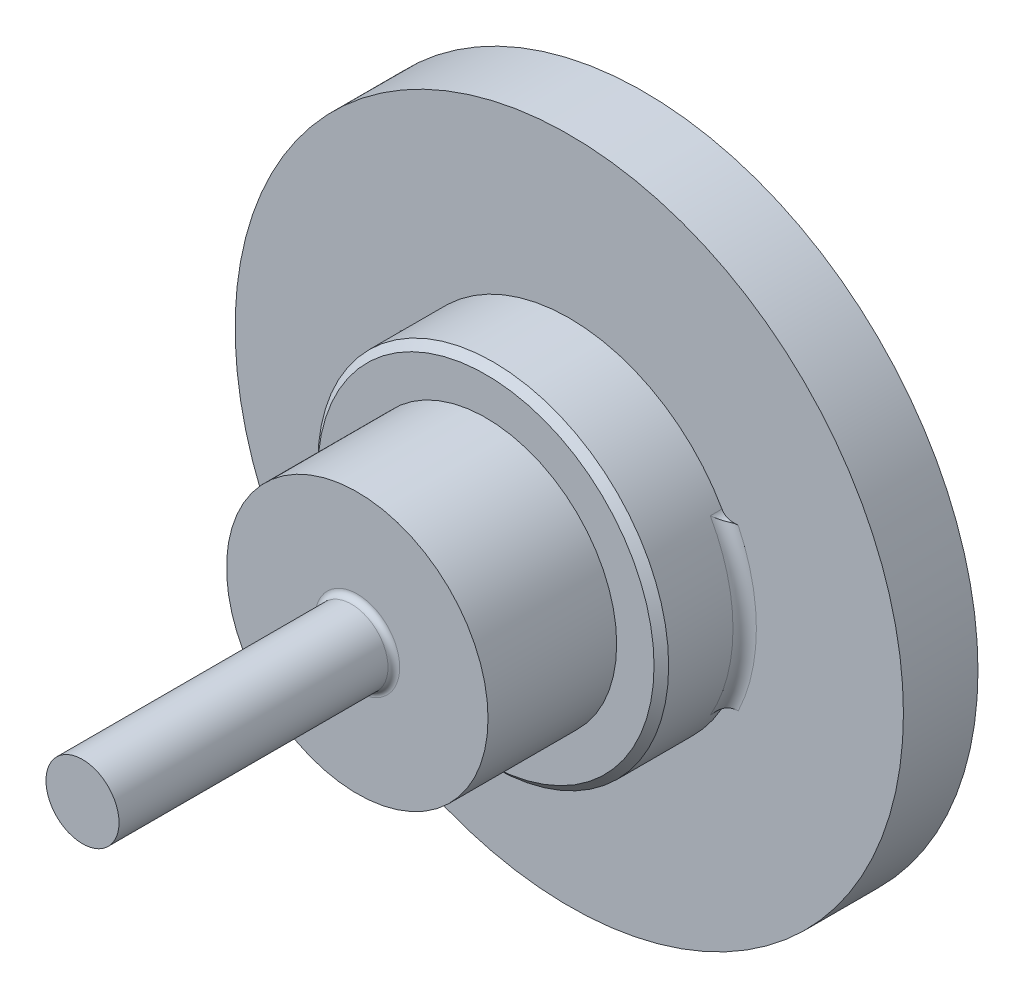
ISO-10303-21;
HEADER;
FILE_DESCRIPTION(('STEP AP214'),'2;1');
FILE_NAME('part.step','',(''),(''),'','','');
FILE_SCHEMA(('AUTOMOTIVE_DESIGN { 1 0 10303 214 1 1 1 1 }'));
ENDSEC;
DATA;
#1=APPLICATION_CONTEXT('core data for automotive mechanical design processes');
#2=APPLICATION_PROTOCOL_DEFINITION('international standard','automotive_design',2000,#1);
#3=PRODUCT_CONTEXT('',#1,'mechanical');
#4=PRODUCT('Part','Part','',(#3));
#5=PRODUCT_RELATED_PRODUCT_CATEGORY('part','',(#4));
#6=PRODUCT_DEFINITION_FORMATION('','',#4);
#7=PRODUCT_DEFINITION_CONTEXT('part definition',#1,'design');
#8=PRODUCT_DEFINITION('design','',#6,#7);
#9=PRODUCT_DEFINITION_SHAPE('','',#8);
#10=(LENGTH_UNIT() NAMED_UNIT(*) SI_UNIT(.MILLI.,.METRE.));
#11=(NAMED_UNIT(*) PLANE_ANGLE_UNIT() SI_UNIT($,.RADIAN.));
#12=(NAMED_UNIT(*) SI_UNIT($,.STERADIAN.) SOLID_ANGLE_UNIT());
#13=UNCERTAINTY_MEASURE_WITH_UNIT(LENGTH_MEASURE(1.E-05),#10,'distance_accuracy_value','');
#14=(GEOMETRIC_REPRESENTATION_CONTEXT(3) GLOBAL_UNCERTAINTY_ASSIGNED_CONTEXT((#13)) GLOBAL_UNIT_ASSIGNED_CONTEXT((#10,
#11,#12)) REPRESENTATION_CONTEXT('',''));
#15=CARTESIAN_POINT('',(0.,0.,0.));
#16=DIRECTION('',(0.,0.,1.));
#17=DIRECTION('',(1.,0.,0.));
#18=AXIS2_PLACEMENT_3D('',#15,#16,#17);
#19=CARTESIAN_POINT('',(0.,0.,93.9999996618));
#20=DIRECTION('',(0.,0.,1.));
#21=DIRECTION('',(1.,0.,0.));
#22=AXIS2_PLACEMENT_3D('',#19,#20,#21);
#23=PLANE('',#22);
#24=CARTESIAN_POINT('',(0.,0.,93.9999996618));
#25=DIRECTION('',(0.,0.,1.));
#26=DIRECTION('',(1.,0.,0.));
#27=AXIS2_PLACEMENT_3D('',#24,#25,#26);
#28=CIRCLE('',#27,6.24999997775);
#29=CARTESIAN_POINT('',(6.24999997775,0.,93.9999996618));
#30=VERTEX_POINT('',#29);
#31=EDGE_CURVE('E14',#30,#30,#28,.T.);
#32=ORIENTED_EDGE('',*,*,#31,.T.);
#33=EDGE_LOOP('',(#32));
#34=FACE_BOUND('',#33,.T.);
#35=ADVANCED_FACE('F51',(#34),#23,.T.);
#36=CARTESIAN_POINT('',(0.,0.,24.999999911));
#37=DIRECTION('',(0.,0.,1.));
#38=DIRECTION('',(1.,0.,0.));
#39=AXIS2_PLACEMENT_3D('',#36,#37,#38);
#40=PLANE('',#39);
#41=CARTESIAN_POINT('',(0.,0.,24.999999911));
#42=DIRECTION('',(0.,0.,1.));
#43=DIRECTION('',(1.,0.,0.));
#44=AXIS2_PLACEMENT_3D('',#41,#42,#43);
#45=CIRCLE('',#44,22.3588115081785);
#46=CARTESIAN_POINT('',(22.3588115081785,0.,24.999999911));
#47=VERTEX_POINT('',#46);
#48=EDGE_CURVE('E176',#47,#47,#45,.T.);
#49=ORIENTED_EDGE('',*,*,#48,.F.);
#50=EDGE_LOOP('',(#49));
#51=FACE_BOUND('',#50,.T.);
#52=CARTESIAN_POINT('',(0.,0.,24.9999999110001));
#53=DIRECTION('',(0.,0.,-1.));
#54=DIRECTION('',(-1.,0.,0.));
#55=AXIS2_PLACEMENT_3D('',#52,#53,#54);
#56=CIRCLE('',#55,28.7499998976501);
#57=CARTESIAN_POINT('',(-28.7499998976501,0.,24.9999999110001));
#58=VERTEX_POINT('',#57);
#59=EDGE_CURVE('E275',#58,#58,#56,.T.);
#60=ORIENTED_EDGE('',*,*,#59,.F.);
#61=EDGE_LOOP('',(#60));
#62=FACE_BOUND('',#61,.T.);
#63=ADVANCED_FACE('F567',(#51,#62),#40,.T.);
#64=CARTESIAN_POINT('',(0.,0.,23.7499999154499));
#65=DIRECTION('',(0.,0.,-1.));
#66=DIRECTION('',(-1.,0.,0.));
#67=AXIS2_PLACEMENT_3D('',#64,#65,#66);
#68=CONICAL_SURFACE('',#67,29.9999998931999,0.785398163397298);
#69=CARTESIAN_POINT('',(0.,0.,23.74999991545));
#70=DIRECTION('',(0.,0.,1.));
#71=DIRECTION('',(1.,0.,0.));
#72=AXIS2_PLACEMENT_3D('',#69,#70,#71);
#73=CIRCLE('',#72,29.9999998932);
#74=CARTESIAN_POINT('',(29.9999998932,0.,23.74999991545));
#75=VERTEX_POINT('',#74);
#76=EDGE_CURVE('E1326',#75,#75,#73,.F.);
#77=ORIENTED_EDGE('',*,*,#76,.F.);
#78=EDGE_LOOP('',(#77));
#79=FACE_BOUND('',#78,.T.);
#80=ORIENTED_EDGE('',*,*,#59,.T.);
#81=EDGE_LOOP('',(#80));
#82=FACE_BOUND('',#81,.T.);
#83=ADVANCED_FACE('F577',(#79,#82),#68,.T.);
#84=CARTESIAN_POINT('',(0.,0.,4.9999999822));
#85=DIRECTION('',(0.,0.,1.));
#86=DIRECTION('',(1.,0.,0.));
#87=AXIS2_PLACEMENT_3D('',#84,#85,#86);
#88=CYLINDRICAL_SURFACE('',#87,29.9999998932);
#89=CARTESIAN_POINT('',(0.,0.,10.74999996173));
#90=DIRECTION('',(0.,0.,1.));
#91=DIRECTION('',(1.,0.,0.));
#92=AXIS2_PLACEMENT_3D('',#89,#90,#91);
#93=CIRCLE('',#92,29.9999998932);
#94=CARTESIAN_POINT('',(26.1146762071369,-14.765624950824,10.74999996173));
#95=VERTEX_POINT('',#94);
#96=CARTESIAN_POINT('',(-26.1146762071369,-14.765624950824,10.74999996173));
#97=VERTEX_POINT('',#96);
#98=EDGE_CURVE('E197',#95,#97,#93,.F.);
#99=ORIENTED_EDGE('',*,*,#98,.F.);
#100=DIRECTION('',(0.,0.,1.));
#101=VECTOR('',#100,1.);
#102=CARTESIAN_POINT('',(26.1146762071369,-14.765624950824,4.9999999822));
#103=LINE('',#102,#101);
#104=CARTESIAN_POINT('',(26.1146762071369,-14.765624950824,12.74999996173));
#105=VERTEX_POINT('',#104);
#106=EDGE_CURVE('E242',#95,#105,#103,.T.);
#107=ORIENTED_EDGE('',*,*,#106,.T.);
#108=CARTESIAN_POINT('',(0.,0.,12.74999996173));
#109=DIRECTION('',(0.,0.,1.));
#110=DIRECTION('',(1.,0.,0.));
#111=AXIS2_PLACEMENT_3D('',#108,#109,#110);
#112=CIRCLE('',#111,29.9999998932);
#113=CARTESIAN_POINT('',(26.1146762071369,14.765624950824,12.74999996173));
#114=VERTEX_POINT('',#113);
#115=EDGE_CURVE('E387',#105,#114,#112,.T.);
#116=ORIENTED_EDGE('',*,*,#115,.T.);
#117=DIRECTION('',(0.,0.,1.));
#118=VECTOR('',#117,1.);
#119=CARTESIAN_POINT('',(26.1146762071369,14.765624950824,4.9999999822));
#120=LINE('',#119,#118);
#121=CARTESIAN_POINT('',(26.1146762071369,14.765624950824,10.74999996173));
#122=VERTEX_POINT('',#121);
#123=EDGE_CURVE('E750',#114,#122,#120,.F.);
#124=ORIENTED_EDGE('',*,*,#123,.T.);
#125=CARTESIAN_POINT('',(-26.1146762071369,14.765624950824,10.74999996173));
#126=VERTEX_POINT('',#125);
#127=EDGE_CURVE('E73',#126,#122,#93,.F.);
#128=ORIENTED_EDGE('',*,*,#127,.F.);
#129=DIRECTION('',(0.,0.,1.));
#130=VECTOR('',#129,1.);
#131=CARTESIAN_POINT('',(-26.1146762071369,14.765624950824,4.9999999822));
#132=LINE('',#131,#130);
#133=CARTESIAN_POINT('',(-26.1146762071369,14.765624950824,12.74999996173));
#134=VERTEX_POINT('',#133);
#135=EDGE_CURVE('E236',#126,#134,#132,.T.);
#136=ORIENTED_EDGE('',*,*,#135,.T.);
#137=CARTESIAN_POINT('',(0.,0.,12.74999996173));
#138=DIRECTION('',(0.,0.,1.));
#139=DIRECTION('',(1.,0.,0.));
#140=AXIS2_PLACEMENT_3D('',#137,#138,#139);
#141=CIRCLE('',#140,29.9999998932);
#142=CARTESIAN_POINT('',(-26.1146762071369,-14.765624950824,12.74999996173));
#143=VERTEX_POINT('',#142);
#144=EDGE_CURVE('E885',#134,#143,#141,.T.);
#145=ORIENTED_EDGE('',*,*,#144,.T.);
#146=DIRECTION('',(0.,0.,1.));
#147=VECTOR('',#146,1.);
#148=CARTESIAN_POINT('',(-26.1146762071369,-14.765624950824,4.9999999822));
#149=LINE('',#148,#147);
#150=EDGE_CURVE('E906',#143,#97,#149,.F.);
#151=ORIENTED_EDGE('',*,*,#150,.T.);
#152=EDGE_LOOP('',(#99,#107,#116,#124,#128,#136,#145,#151));
#153=FACE_BOUND('',#152,.T.);
#154=ORIENTED_EDGE('',*,*,#76,.T.);
#155=EDGE_LOOP('',(#154));
#156=FACE_BOUND('',#155,.T.);
#157=ADVANCED_FACE('F916',(#153,#156),#88,.T.);
#158=CARTESIAN_POINT('',(-27.855654627144,-15.74999995105,4.9999999822));
#159=DIRECTION('',(0.,0.,1.));
#160=DIRECTION('',(1.,0.,0.));
#161=AXIS2_PLACEMENT_3D('',#158,#159,#160);
#162=CYLINDRICAL_SURFACE('',#161,2.);
#163=DIRECTION('',(0.,0.,-1.));
#164=VECTOR('',#163,1.);
#165=CARTESIAN_POINT('',(-27.855654627144,-13.74999995105,4.9999999822));
#166=LINE('',#165,#164);
#167=CARTESIAN_POINT('',(-27.855654627144,-13.74999995105,10.74999996173));
#168=VERTEX_POINT('',#167);
#169=CARTESIAN_POINT('',(-27.8556546271439,-13.74999995105,10.982305254763));
#170=VERTEX_POINT('',#169);
#171=EDGE_CURVE('E526',#168,#170,#166,.F.);
#172=ORIENTED_EDGE('',*,*,#171,.F.);
#173=CARTESIAN_POINT('',(-27.855654627144,-15.74999995105,10.74999996173));
#174=DIRECTION('',(0.,0.,1.));
#175=DIRECTION('',(1.,0.,0.));
#176=AXIS2_PLACEMENT_3D('',#173,#174,#175);
#177=CIRCLE('',#176,2.);
#178=EDGE_CURVE('E65',#168,#97,#177,.F.);
#179=ORIENTED_EDGE('',*,*,#178,.T.);
#180=ORIENTED_EDGE('',*,*,#150,.F.);
#181=CARTESIAN_POINT('',(-27.855654627144,-13.74999995105,10.982305254763));
#182=CARTESIAN_POINT('',(-27.8313606597694,-13.7500003890343,10.9938345583865));
#183=CARTESIAN_POINT('',(-27.8072266103018,-13.7504476350383,11.0056958861992));
#184=CARTESIAN_POINT('',(-27.7588066246078,-13.7522138707827,11.0302933425393));
#185=CARTESIAN_POINT('',(-27.7345279699694,-13.7535507987732,11.043042535003));
#186=CARTESIAN_POINT('',(-27.6858546732368,-13.7571084319172,11.0694174048585));
#187=CARTESIAN_POINT('',(-27.6614682878886,-13.7593470936084,11.0830558605991));
#188=CARTESIAN_POINT('',(-27.6126144011471,-13.7647215409892,11.1112097021366));
#189=CARTESIAN_POINT('',(-27.5881560489802,-13.7678752624635,11.1257375203609));
#190=CARTESIAN_POINT('',(-27.539193893966,-13.7750936627142,11.15566855148));
#191=CARTESIAN_POINT('',(-27.5147000875535,-13.7791762108212,11.1710837848152));
#192=CARTESIAN_POINT('',(-27.4657028607032,-13.7882667566445,11.202786260134));
#193=CARTESIAN_POINT('',(-27.4412102256504,-13.7932925249166,11.219085056376));
#194=CARTESIAN_POINT('',(-27.3922514677708,-13.8042847838722,11.2525491333906));
#195=CARTESIAN_POINT('',(-27.367796865183,-13.8102689250243,11.2697254500589));
#196=CARTESIAN_POINT('',(-27.3189502049049,-13.8231932424153,11.3049374308567));
#197=CARTESIAN_POINT('',(-27.2945703426456,-13.8301509192724,11.3229835787095));
#198=CARTESIAN_POINT('',(-27.2500373381576,-13.843777583964,11.3567908059341));
#199=CARTESIAN_POINT('',(-27.2298000539143,-13.8503325602401,11.3724872716226));
#200=CARTESIAN_POINT('',(-27.1892453854812,-13.8641817929777,11.404603594771));
#201=CARTESIAN_POINT('',(-27.1689395693626,-13.871490827361,11.421031652432));
#202=CARTESIAN_POINT('',(-27.10718177185,-13.8948400457953,11.4720441411635));
#203=CARTESIAN_POINT('',(-27.0664956810631,-13.9118097500889,11.5071375154306));
#204=CARTESIAN_POINT('',(-26.9851662283147,-13.9488433471493,11.5802153607757));
#205=CARTESIAN_POINT('',(-26.944625570408,-13.9690191326553,11.6182568235603));
#206=CARTESIAN_POINT('',(-26.8638662472033,-14.0126127939556,11.6972183192776));
#207=CARTESIAN_POINT('',(-26.823755921592,-14.0361396429998,11.7381889713169));
#208=CARTESIAN_POINT('',(-26.7521965870043,-14.0815075877282,11.814370265486));
#209=CARTESIAN_POINT('',(-26.7203914359796,-14.1030121500848,11.8494486651928));
#210=CARTESIAN_POINT('',(-26.6562540943645,-14.1490730322139,11.922689105163));
#211=CARTESIAN_POINT('',(-26.6240466813853,-14.1737376167037,11.9608923610095));
#212=CARTESIAN_POINT('',(-26.5594712384655,-14.2263200478081,12.0404058642384));
#213=CARTESIAN_POINT('',(-26.5272363336648,-14.2543451516223,12.081753120417));
#214=CARTESIAN_POINT('',(-26.4629973072764,-14.3138550068254,12.1675539983191));
#215=CARTESIAN_POINT('',(-26.4311347046991,-14.3454464989986,12.2120396832831));
#216=CARTESIAN_POINT('',(-26.3796575923875,-14.4000614264173,12.2870244762664));
#217=CARTESIAN_POINT('',(-26.3593888779643,-14.4225881609983,12.3174395904513));
#218=CARTESIAN_POINT('',(-26.3155196205064,-14.4736016433946,12.3853372887643));
#219=CARTESIAN_POINT('',(-26.2922049213142,-14.502282174075,12.4228595196564));
#220=CARTESIAN_POINT('',(-26.2431592414998,-14.5661025763612,12.5050594729249));
#221=CARTESIAN_POINT('',(-26.2177772499626,-14.6014571337432,12.5497788681545));
#222=CARTESIAN_POINT('',(-26.1656749187223,-14.6792635005503,12.6463301745204));
#223=CARTESIAN_POINT('',(-26.1393630249264,-14.7219623723626,12.6981838331913));
#224=CARTESIAN_POINT('',(-26.1146762071369,-14.765624950824,12.74999996173));
#225=B_SPLINE_CURVE_WITH_KNOTS('',3,(#181,#182,#183,#184,#185,#186,#187,#188,#189,#190,#191,
#192,#193,#194,#195,#196,#197,#198,#199,#200,#201,#202,#203,#204,#205,#206,#207,#208,#209,#210,
#211,#212,#213,#214,#215,#216,#217,#218,#219,#220,#221,#222,#223,#224),.UNSPECIFIED.,.F.,.F.,(4,
2,2,2,2,2,2,2,2,2,2,2,2,2,2,2,2,2,2,2,2,4),(0.,0.0806634965965827,0.163004744463219,
0.247073845556376,0.332917133863128,0.420577477737024,0.510094576400851,0.601505248008722,
0.69484370741353,0.774141650707695,0.855498913779222,1.02443113138507,1.20176267419495,
1.38758415314271,1.54354838972918,1.71065883387659,1.88893778710208,2.07840834684108,
2.20719128999348,2.36515836577507,2.55229983204407,2.76862205685418),.UNSPECIFIED.);
#226=EDGE_CURVE('E902',#143,#170,#225,.F.);
#227=ORIENTED_EDGE('',*,*,#226,.T.);
#228=EDGE_LOOP('',(#172,#179,#180,#227));
#229=FACE_BOUND('',#228,.T.);
#230=ADVANCED_FACE('F908',(#229),#162,.F.);
#231=CARTESIAN_POINT('',(0.,0.,12.74999996173));
#232=DIRECTION('',(0.,0.,1.));
#233=DIRECTION('',(1.,0.,0.));
#234=AXIS2_PLACEMENT_3D('',#231,#232,#233);
#235=TOROIDAL_SURFACE('',#234,31.9999998932,2.);
#236=CARTESIAN_POINT('',(0.,0.,10.74999996173));
#237=DIRECTION('',(0.,0.,1.));
#238=DIRECTION('',(-0.902977658874189,0.429687499904394,0.));
#239=AXIS2_PLACEMENT_3D('',#236,#237,#238);
#240=CIRCLE('',#239,31.9999998932);
#241=CARTESIAN_POINT('',(-28.8952849875361,-13.74999995105,10.74999996173));
#242=VERTEX_POINT('',#241);
#243=CARTESIAN_POINT('',(-28.8952849875361,13.74999995105,10.74999996173));
#244=VERTEX_POINT('',#243);
#245=EDGE_CURVE('E235',#242,#244,#240,.F.);
#246=ORIENTED_EDGE('',*,*,#245,.F.);
#247=CARTESIAN_POINT('',(-27.855654627144,-13.74999995105,10.982305254763));
#248=CARTESIAN_POINT('',(-27.9178127511627,-13.74999995105,10.9528129396242));
#249=CARTESIAN_POINT('',(-27.9812260500475,-13.74999995105,10.9260684109438));
#250=CARTESIAN_POINT('',(-28.1101188093252,-13.74999995105,10.8781490136994));
#251=CARTESIAN_POINT('',(-28.1755981053252,-13.74999995105,10.8569737032341));
#252=CARTESIAN_POINT('',(-28.3719716499392,-13.74999995105,10.802601943346));
#253=CARTESIAN_POINT('',(-28.5051913497212,-13.74999995105,10.7774407150519));
#254=CARTESIAN_POINT('',(-28.7244964990831,-13.74999995105,10.754447790169));
#255=CARTESIAN_POINT('',(-28.8099371282313,-13.74999995105,10.7499751202463));
#256=CARTESIAN_POINT('',(-28.8952849875361,-13.74999995105,10.74999996173));
#257=B_SPLINE_CURVE_WITH_KNOTS('',3,(#247,#248,#249,#250,#251,#252,#253,#254,#255,#256),
.UNSPECIFIED.,.F.,.F.,(4,2,2,2,4),(0.,0.206250758155841,0.412485145969034,0.817138503885399,
1.07328518109174),.UNSPECIFIED.);
#258=EDGE_CURVE('E303',#170,#242,#257,.T.);
#259=ORIENTED_EDGE('',*,*,#258,.F.);
#260=ORIENTED_EDGE('',*,*,#226,.F.);
#261=ORIENTED_EDGE('',*,*,#144,.F.);
#262=CARTESIAN_POINT('',(-26.1146762071369,14.765624950824,12.74999996173));
#263=CARTESIAN_POINT('',(-26.1313920927471,14.7360599304986,12.7149214412148));
#264=CARTESIAN_POINT('',(-26.1488542031414,14.7069351269997,12.6798278954533));
#265=CARTESIAN_POINT('',(-26.1836784838701,14.6520765798892,12.6127685637375));
#266=CARTESIAN_POINT('',(-26.2009155210997,14.6262692113248,12.580797970986));
#267=CARTESIAN_POINT('',(-26.2349221895975,14.5778262143379,12.5200323193687));
#268=CARTESIAN_POINT('',(-26.2515780483896,14.5551238059538,12.4912268281741));
#269=CARTESIAN_POINT('',(-26.2840826447946,14.5127028718829,12.436798767653));
#270=CARTESIAN_POINT('',(-26.299829529167,14.4929233154975,12.4111627493576));
#271=CARTESIAN_POINT('',(-26.3425310747403,14.4412718342922,12.3435697334077));
#272=CARTESIAN_POINT('',(-26.3701752488057,14.4098120242191,12.3017295958753));
#273=CARTESIAN_POINT('',(-26.419285437427,14.3573153669361,12.2304205438232));
#274=CARTESIAN_POINT('',(-26.4402273802117,14.3358943853573,12.2008717086682));
#275=CARTESIAN_POINT('',(-26.4860132862095,14.2912976669675,12.137851808553));
#276=CARTESIAN_POINT('',(-26.5110050521501,14.2682691691579,12.1043834812331));
#277=CARTESIAN_POINT('',(-26.562259104819,14.2234586194375,12.0379750153884));
#278=CARTESIAN_POINT('',(-26.5885133765784,14.2016702356643,12.0050329572713));
#279=CARTESIAN_POINT('',(-26.6422768874027,14.1593883095238,11.9397217050599));
#280=CARTESIAN_POINT('',(-26.6697783976501,14.1388882825636,11.9073503523216));
#281=CARTESIAN_POINT('',(-26.7260377000163,14.0991279509751,11.8433117306198));
#282=CARTESIAN_POINT('',(-26.7547879537262,14.0798615807753,11.8116416144187));
#283=CARTESIAN_POINT('',(-26.8061259145993,14.0473194042948,11.7569356534096));
#284=CARTESIAN_POINT('',(-26.8284033621585,14.0337743282417,11.7337682421739));
#285=CARTESIAN_POINT('',(-26.873114127404,14.0077912355914,11.6883759937418));
#286=CARTESIAN_POINT('',(-26.8955270848782,13.9953332273081,11.666142576067));
#287=CARTESIAN_POINT('',(-26.9404543677966,13.9714806527982,11.6226353970289));
#288=CARTESIAN_POINT('',(-26.9629488920382,13.9600662452418,11.601352071763));
#289=CARTESIAN_POINT('',(-27.0079842507533,13.9382779408261,11.5597445411535));
#290=CARTESIAN_POINT('',(-27.0305059141917,13.9278837858421,11.5394102096812));
#291=CARTESIAN_POINT('',(-27.0755420230893,13.9081095988314,11.4997000294253));
#292=CARTESIAN_POINT('',(-27.0980379490324,13.8987089662716,11.4803134502266));
#293=CARTESIAN_POINT('',(-27.1429702327183,13.8808986058221,11.4424936754764));
#294=CARTESIAN_POINT('',(-27.1653887598321,13.8724678234256,11.4240492279031));
#295=CARTESIAN_POINT('',(-27.2101153639349,13.856573893124,11.3881062332227));
#296=CARTESIAN_POINT('',(-27.2324063353418,13.8490892138654,11.3705959412633));
#297=CARTESIAN_POINT('',(-27.2768283628523,13.8350703323611,11.3365088961869));
#298=CARTESIAN_POINT('',(-27.2989430839375,13.8285139097244,11.3199200148384));
#299=CARTESIAN_POINT('',(-27.3432599244649,13.8162381089661,11.287451613282));
#300=CARTESIAN_POINT('',(-27.3654529336398,13.8105055390726,11.2715646555224));
#301=CARTESIAN_POINT('',(-27.4099198679512,13.7998468720123,11.2404997859388));
#302=CARTESIAN_POINT('',(-27.4321855445503,13.7949083918519,11.2253143248221));
#303=CARTESIAN_POINT('',(-27.4767716260299,13.7858306286953,11.195659323555));
#304=CARTESIAN_POINT('',(-27.4990842389731,13.7816788606535,11.1811819019521));
#305=CARTESIAN_POINT('',(-27.5437379579337,13.7741633281966,11.1529502847259));
#306=CARTESIAN_POINT('',(-27.5660717594892,13.7707870669813,11.1391878737124));
#307=CARTESIAN_POINT('',(-27.6107415138131,13.7648127508434,11.1123917995904));
#308=CARTESIAN_POINT('',(-27.6330706820114,13.7622021897496,11.0993496276769));
#309=CARTESIAN_POINT('',(-27.6777047125124,13.7577495103276,11.0739984127333));
#310=CARTESIAN_POINT('',(-27.7000033426533,13.7558949066989,11.0616806013924));
#311=CARTESIAN_POINT('',(-27.7445501272201,13.7529446654549,11.0377811154021));
#312=CARTESIAN_POINT('',(-27.7667926267529,13.7518365940865,11.0261904556901));
#313=CARTESIAN_POINT('',(-27.8112000095962,13.7503705093042,11.0037473795829));
#314=CARTESIAN_POINT('',(-27.8333598598546,13.7500001447557,10.9928858013545));
#315=CARTESIAN_POINT('',(-27.855654627144,13.74999995105,10.982305254763));
#316=B_SPLINE_CURVE_WITH_KNOTS('',3,(#262,#263,#264,#265,#266,#267,#268,#269,#270,#271,#272,
#273,#274,#275,#276,#277,#278,#279,#280,#281,#282,#283,#284,#285,#286,#287,#288,#289,#290,#291,
#292,#293,#294,#295,#296,#297,#298,#299,#300,#301,#302,#303,#304,#305,#306,#307,#308,#309,#310,
#311,#312,#313,#314,#315),.UNSPECIFIED.,.F.,.F.,(4,2,2,2,2,2,2,2,2,2,2,2,2,2,2,2,2,2,2,2,2,2,2,
2,2,2,4),(0.,0.146470564946462,0.280115862269158,0.400941235662771,0.508947466800075,
0.686479887469512,0.812692926917814,0.955746768350122,1.09798878954254,1.23944550404423,
1.38014267650062,1.48476071210181,1.58656088478813,1.68555668941552,1.78176257893177,
1.87519423407305,1.96586885868419,2.05380550467401,2.13902543129554,2.22267589556609,
2.30485897919976,2.38560234913588,2.46493544634906,2.54288963899973,2.6194983785609,
2.69479735769761,2.76882466835811),.UNSPECIFIED.);
#317=CARTESIAN_POINT('',(-27.8556546271439,13.74999995105,10.982305254763));
#318=VERTEX_POINT('',#317);
#319=EDGE_CURVE('E240',#134,#318,#316,.T.);
#320=ORIENTED_EDGE('',*,*,#319,.T.);
#321=CARTESIAN_POINT('',(-28.8952849875361,13.74999995105,10.74999996173));
#322=CARTESIAN_POINT('',(-28.8264980476577,13.74999995105,10.7500082289681));
#323=CARTESIAN_POINT('',(-28.757760465614,13.74999995105,10.7528959290699));
#324=CARTESIAN_POINT('',(-28.620723769416,13.74999995105,10.7644262812124));
#325=CARTESIAN_POINT('',(-28.5524249789807,13.74999995105,10.773072777902));
#326=CARTESIAN_POINT('',(-28.3514898603366,13.74999995105,10.8071880983912));
#327=CARTESIAN_POINT('',(-28.2200928300391,13.74999995105,10.84083793373));
#328=CARTESIAN_POINT('',(-28.0524296163105,13.74999995105,10.8992023769958));
#329=CARTESIAN_POINT('',(-28.0125942643843,13.74999995105,10.9142742515446));
#330=CARTESIAN_POINT('',(-27.9335607748302,13.74999995105,10.9466351101659));
#331=CARTESIAN_POINT('',(-27.8943677682221,13.74999995105,10.9639366224977));
#332=CARTESIAN_POINT('',(-27.8556546271439,13.74999995105,10.982305254763));
#333=B_SPLINE_CURVE_WITH_KNOTS('',3,(#321,#322,#323,#324,#325,#326,#327,#328,#329,#330,#331,
#332),.UNSPECIFIED.,.F.,.F.,(4,2,2,2,2,4),(0.,0.206201880149069,0.412541561583452,
0.81714995037727,0.944884609287487,1.07337114682411),.UNSPECIFIED.);
#334=EDGE_CURVE('E241',#244,#318,#333,.T.);
#335=ORIENTED_EDGE('',*,*,#334,.F.);
#336=EDGE_LOOP('',(#246,#259,#260,#261,#320,#335));
#337=FACE_BOUND('',#336,.T.);
#338=ADVANCED_FACE('F279',(#337),#235,.F.);
#339=CARTESIAN_POINT('',(-27.855654627144,15.74999995105,4.9999999822));
#340=DIRECTION('',(0.,0.,1.));
#341=DIRECTION('',(1.,0.,0.));
#342=AXIS2_PLACEMENT_3D('',#339,#340,#341);
#343=CYLINDRICAL_SURFACE('',#342,2.);
#344=ORIENTED_EDGE('',*,*,#135,.F.);
#345=CARTESIAN_POINT('',(-27.855654627144,15.74999995105,10.74999996173));
#346=DIRECTION('',(0.,0.,1.));
#347=DIRECTION('',(1.,0.,0.));
#348=AXIS2_PLACEMENT_3D('',#345,#346,#347);
#349=CIRCLE('',#348,2.);
#350=CARTESIAN_POINT('',(-27.855654627144,13.74999995105,10.74999996173));
#351=VERTEX_POINT('',#350);
#352=EDGE_CURVE('E193',#126,#351,#349,.F.);
#353=ORIENTED_EDGE('',*,*,#352,.T.);
#354=DIRECTION('',(0.,0.,1.));
#355=VECTOR('',#354,1.);
#356=CARTESIAN_POINT('',(-27.855654627144,13.74999995105,8.81244797191768));
#357=LINE('',#356,#355);
#358=EDGE_CURVE('E515',#318,#351,#357,.F.);
#359=ORIENTED_EDGE('',*,*,#358,.F.);
#360=ORIENTED_EDGE('',*,*,#319,.F.);
#361=EDGE_LOOP('',(#344,#353,#359,#360));
#362=FACE_BOUND('',#361,.T.);
#363=ADVANCED_FACE('F739',(#362),#343,.F.);
#364=CARTESIAN_POINT('',(27.855654627144,-15.74999995105,4.9999999822));
#365=DIRECTION('',(0.,0.,1.));
#366=DIRECTION('',(1.,0.,0.));
#367=AXIS2_PLACEMENT_3D('',#364,#365,#366);
#368=CYLINDRICAL_SURFACE('',#367,2.);
#369=ORIENTED_EDGE('',*,*,#106,.F.);
#370=CARTESIAN_POINT('',(27.855654627144,-15.74999995105,10.74999996173));
#371=DIRECTION('',(0.,0.,1.));
#372=DIRECTION('',(1.,0.,0.));
#373=AXIS2_PLACEMENT_3D('',#370,#371,#372);
#374=CIRCLE('',#373,2.);
#375=CARTESIAN_POINT('',(27.8556546271439,-13.74999995105,10.74999996173));
#376=VERTEX_POINT('',#375);
#377=EDGE_CURVE('E195',#95,#376,#374,.F.);
#378=ORIENTED_EDGE('',*,*,#377,.T.);
#379=DIRECTION('',(0.,0.,-1.));
#380=VECTOR('',#379,1.);
#381=CARTESIAN_POINT('',(27.8556546271439,-13.74999995105,4.9999999822));
#382=LINE('',#381,#380);
#383=CARTESIAN_POINT('',(27.8556546271439,-13.74999995105,10.982305254763));
#384=VERTEX_POINT('',#383);
#385=EDGE_CURVE('E514',#384,#376,#382,.T.);
#386=ORIENTED_EDGE('',*,*,#385,.F.);
#387=CARTESIAN_POINT('',(26.1146762071369,-14.765624950824,12.74999996173));
#388=CARTESIAN_POINT('',(26.1313920927862,-14.7360599304295,12.7149214411327));
#389=CARTESIAN_POINT('',(26.1488542032231,-14.7069351268635,12.6798278952893));
#390=CARTESIAN_POINT('',(26.1836784840317,-14.6520765796415,12.6127685634334));
#391=CARTESIAN_POINT('',(26.2009155212972,-14.6262692110322,12.5807979706239));
#392=CARTESIAN_POINT('',(26.234922189858,-14.5778262139762,12.5200323189147));
#393=CARTESIAN_POINT('',(26.2515780486761,-14.5551238055674,12.4912268276861));
#394=CARTESIAN_POINT('',(26.2840826451209,-14.5127028714664,12.4367987671206));
#395=CARTESIAN_POINT('',(26.2998295295062,-14.4929233150752,12.4111627488146));
#396=CARTESIAN_POINT('',(26.3425310750734,-14.4412718339042,12.3435697329036));
#397=CARTESIAN_POINT('',(26.3701752491172,-14.4098120238689,12.3017295954206));
#398=CARTESIAN_POINT('',(26.4192854376231,-14.3573153667324,12.2304205435522));
#399=CARTESIAN_POINT('',(26.4402273803119,-14.3358943852581,12.2008717085325));
#400=CARTESIAN_POINT('',(26.4860132864638,-14.2912976667216,12.1378518082002));
#401=CARTESIAN_POINT('',(26.5110050526731,-14.2682691686795,12.1043834805283));
#402=CARTESIAN_POINT('',(26.5622591057317,-14.2234586186638,12.0379750142288));
#403=CARTESIAN_POINT('',(26.5885133776022,-14.20167023482,12.0050329560065));
#404=CARTESIAN_POINT('',(26.6422768884681,-14.1593883086977,11.9397217038166));
#405=CARTESIAN_POINT('',(26.6697783986362,-14.1388882818181,11.9073503512024));
#406=CARTESIAN_POINT('',(26.7260377006322,-14.0991279505399,11.8433117299618));
#407=CARTESIAN_POINT('',(26.7547879540414,-14.0798615805619,11.8116416140942));
#408=CARTESIAN_POINT('',(26.8061259147016,-14.0473194042401,11.7569356532921));
#409=CARTESIAN_POINT('',(26.8284033623669,-14.0337743281381,11.733768241939));
#410=CARTESIAN_POINT('',(26.8731141278023,-14.0077912354052,11.6883759933127));
#411=CARTESIAN_POINT('',(26.8955270853594,-13.9953332270876,11.6661425755606));
#412=CARTESIAN_POINT('',(26.9404543684171,-13.9714806525265,11.6226353964037));
#413=CARTESIAN_POINT('',(26.9629488927141,-13.9600662449524,11.6013520710958));
#414=CARTESIAN_POINT('',(27.0079842515103,-13.9382779405163,11.5597445404364));
#415=CARTESIAN_POINT('',(27.0305059149734,-13.9278837855287,11.5394102089557));
#416=CARTESIAN_POINT('',(27.0755420238873,-13.9081095985248,11.4997000287143));
#417=CARTESIAN_POINT('',(27.0980379498211,-13.8987089659744,11.4803134495379));
#418=CARTESIAN_POINT('',(27.1429702334523,-13.8808986055566,11.4424936748608));
#419=CARTESIAN_POINT('',(27.1653887605199,-13.8724678231814,11.4240492273378));
#420=CARTESIAN_POINT('',(27.2101153644915,-13.8565738929338,11.3881062327836));
#421=CARTESIAN_POINT('',(27.2324063358127,-13.8490892137067,11.3705959408997));
#422=CARTESIAN_POINT('',(27.2768283631105,-13.835070332278,11.3365088959961));
#423=CARTESIAN_POINT('',(27.298943084068,-13.8285139096842,11.3199200147445));
#424=CARTESIAN_POINT('',(27.3432599244881,-13.8162381089636,11.2874516132632));
#425=CARTESIAN_POINT('',(27.3654529336871,-13.8105055390698,11.2715646554847));
#426=CARTESIAN_POINT('',(27.4099198680406,-13.7998468720086,11.2404997858705));
#427=CARTESIAN_POINT('',(27.4321855446578,-13.7949083918473,11.2253143247421));
#428=CARTESIAN_POINT('',(27.4767716261673,-13.7858306286899,11.1956593234573));
#429=CARTESIAN_POINT('',(27.4990842391223,-13.7816788606482,11.1811819018484));
#430=CARTESIAN_POINT('',(27.5437379580994,-13.7741633281916,11.1529502846158));
#431=CARTESIAN_POINT('',(27.5660717596597,-13.7707870669766,11.1391878736016));
#432=CARTESIAN_POINT('',(27.6107415139859,-13.7648127508396,11.1123917994831));
#433=CARTESIAN_POINT('',(27.6330706821817,-13.7622021897462,11.0993496275737));
#434=CARTESIAN_POINT('',(27.6777047126699,-13.7577495103253,11.0739984126423));
#435=CARTESIAN_POINT('',(27.7000033428003,-13.755894906697,11.0616806013094));
#436=CARTESIAN_POINT('',(27.7445501273384,-13.7529446654541,11.0377811153386));
#437=CARTESIAN_POINT('',(27.7667926268527,-13.7518365940859,11.0261904556379));
#438=CARTESIAN_POINT('',(27.8112000096506,-13.7503705093041,11.0037473795561));
#439=CARTESIAN_POINT('',(27.833359859882,-13.7500001447557,10.9928858013415));
#440=CARTESIAN_POINT('',(27.8556546271439,-13.74999995105,10.982305254763));
#441=B_SPLINE_CURVE_WITH_KNOTS('',3,(#387,#388,#389,#390,#391,#392,#393,#394,#395,#396,#397,
#398,#399,#400,#401,#402,#403,#404,#405,#406,#407,#408,#409,#410,#411,#412,#413,#414,#415,#416,
#417,#418,#419,#420,#421,#422,#423,#424,#425,#426,#427,#428,#429,#430,#431,#432,#433,#434,#435,
#436,#437,#438,#439,#440),.UNSPECIFIED.,.F.,.F.,(4,2,2,2,2,2,2,2,2,2,2,2,2,2,2,2,2,2,2,2,2,2,2,
2,2,2,4),(0.,0.146470565288923,0.280115862856335,0.400941236396851,0.508947467583222,
0.686479888057084,0.812692926917701,0.955746769849027,1.09798879154224,1.23944550554493,
1.38014267650099,1.48476071259642,1.58656088563659,1.68555669047689,1.78176258006465,
1.87519423513561,1.96586885953426,2.05380550516918,2.1390254312933,2.22267589565346,
2.30485897935141,2.38560234932626,2.46493544655246,2.54288963919029,2.61949837871265,
2.69479735778451,2.76882466835405),.UNSPECIFIED.);
#442=EDGE_CURVE('E754',#384,#105,#441,.F.);
#443=ORIENTED_EDGE('',*,*,#442,.T.);
#444=EDGE_LOOP('',(#369,#378,#386,#443));
#445=FACE_BOUND('',#444,.T.);
#446=ADVANCED_FACE('F768',(#445),#368,.F.);
#447=CARTESIAN_POINT('',(27.855654627144,15.74999995105,4.9999999822));
#448=DIRECTION('',(0.,0.,1.));
#449=DIRECTION('',(1.,0.,0.));
#450=AXIS2_PLACEMENT_3D('',#447,#448,#449);
#451=CYLINDRICAL_SURFACE('',#450,2.);
#452=DIRECTION('',(0.,0.,1.));
#453=VECTOR('',#452,1.);
#454=CARTESIAN_POINT('',(27.8556546271439,13.74999995105,8.81244797191768));
#455=LINE('',#454,#453);
#456=CARTESIAN_POINT('',(27.8556546271439,13.74999995105,10.74999996173));
#457=VERTEX_POINT('',#456);
#458=CARTESIAN_POINT('',(27.8556546271439,13.74999995105,10.982305254763));
#459=VERTEX_POINT('',#458);
#460=EDGE_CURVE('E148',#457,#459,#455,.T.);
#461=ORIENTED_EDGE('',*,*,#460,.F.);
#462=CARTESIAN_POINT('',(27.855654627144,15.74999995105,10.74999996173));
#463=DIRECTION('',(0.,0.,1.));
#464=DIRECTION('',(1.,0.,0.));
#465=AXIS2_PLACEMENT_3D('',#462,#463,#464);
#466=CIRCLE('',#465,2.);
#467=EDGE_CURVE('E171',#457,#122,#466,.F.);
#468=ORIENTED_EDGE('',*,*,#467,.T.);
#469=ORIENTED_EDGE('',*,*,#123,.F.);
#470=CARTESIAN_POINT('',(27.8556546271439,13.74999995105,10.982305254763));
#471=CARTESIAN_POINT('',(27.8313606597789,13.7500003890343,10.9938345583819));
#472=CARTESIAN_POINT('',(27.8072266103208,13.7504476350383,11.0056958861898));
#473=CARTESIAN_POINT('',(27.7588066246425,13.7522138707824,11.030293342521));
#474=CARTESIAN_POINT('',(27.7345279700105,13.7535507987729,11.0430425349807));
#475=CARTESIAN_POINT('',(27.6858546732879,13.7571084319165,11.0694174048293));
#476=CARTESIAN_POINT('',(27.6614682879432,13.7593470936075,11.083055860567));
#477=CARTESIAN_POINT('',(27.6126144012061,13.7647215409879,11.1112097021001));
#478=CARTESIAN_POINT('',(27.5881560490401,13.767875262462,11.1257375203229));
#479=CARTESIAN_POINT('',(27.539193894025,13.7750936627123,11.1556685514407));
#480=CARTESIAN_POINT('',(27.5147000876108,13.7791762108193,11.171083784776));
#481=CARTESIAN_POINT('',(27.4657028607547,13.7882667566424,11.202786260097));
#482=CARTESIAN_POINT('',(27.4412102256978,13.7932925249145,11.219085056341));
#483=CARTESIAN_POINT('',(27.3922514678079,13.8042847838703,11.2525491333619));
#484=CARTESIAN_POINT('',(27.3677968652139,13.8102689250227,11.2697254500344));
#485=CARTESIAN_POINT('',(27.3189502049214,13.8231932424143,11.3049374308429));
#486=CARTESIAN_POINT('',(27.2945703426539,13.8301509192717,11.3229835787024));
#487=CARTESIAN_POINT('',(27.2500373381535,13.8437775839637,11.356790805938));
#488=CARTESIAN_POINT('',(27.2298000539058,13.8503325602395,11.3724872716308));
#489=CARTESIAN_POINT('',(27.1892453854655,13.864181792977,11.4046035947866));
#490=CARTESIAN_POINT('',(27.168939569344,13.8714908273604,11.4210316524509));
#491=CARTESIAN_POINT('',(27.1071817718267,13.8948400457943,11.4720441411889));
#492=CARTESIAN_POINT('',(27.066495681038,13.9118097500881,11.5071375154591));
#493=CARTESIAN_POINT('',(26.9851662282909,13.948843347149,11.5802153608054));
#494=CARTESIAN_POINT('',(26.9446255703869,13.9690191326551,11.6182568235879));
#495=CARTESIAN_POINT('',(26.8638662471916,14.0126127939556,11.6972183192948));
#496=CARTESIAN_POINT('',(26.8237559215865,14.0361396429999,11.7381889713256));
#497=CARTESIAN_POINT('',(26.7521965870136,14.0815075877251,11.8143702654737));
#498=CARTESIAN_POINT('',(26.7203914359974,14.1030121500784,11.8494486651682));
#499=CARTESIAN_POINT('',(26.6562540943923,14.1490730322022,11.9226891051213));
#500=CARTESIAN_POINT('',(26.624046681415,14.1737376166902,11.9608923609635));
#501=CARTESIAN_POINT('',(26.5594712384933,14.2263200477937,12.0404058641914));
#502=CARTESIAN_POINT('',(26.5272363336892,14.2543451516091,12.0817531203736));
#503=CARTESIAN_POINT('',(26.46299730729,14.3138550068166,12.1675539982926));
#504=CARTESIAN_POINT('',(26.4311347047058,14.3454464989932,12.2120396832703));
#505=CARTESIAN_POINT('',(26.3796575924522,14.4000614263475,12.2870244761742));
#506=CARTESIAN_POINT('',(26.35938887809,14.4225881608569,12.3174395902663));
#507=CARTESIAN_POINT('',(26.3155196207054,14.4736016431534,12.385337288454));
#508=CARTESIAN_POINT('',(26.2922049215274,14.5022821738073,12.4228595193135));
#509=CARTESIAN_POINT('',(26.2431592417,14.5661025760869,12.5050594725795));
#510=CARTESIAN_POINT('',(26.2177772501387,14.6014571334907,12.5497788678398));
#511=CARTESIAN_POINT('',(26.1656749188188,14.6792635003937,12.6463301743308));
#512=CARTESIAN_POINT('',(26.1393630249716,14.7219623722826,12.6981838330964));
#513=CARTESIAN_POINT('',(26.1146762071369,14.765624950824,12.74999996173));
#514=B_SPLINE_CURVE_WITH_KNOTS('',3,(#470,#471,#472,#473,#474,#475,#476,#477,#478,#479,#480,
#481,#482,#483,#484,#485,#486,#487,#488,#489,#490,#491,#492,#493,#494,#495,#496,#497,#498,#499,
#500,#501,#502,#503,#504,#505,#506,#507,#508,#509,#510,#511,#512,#513),.UNSPECIFIED.,.F.,.F.,(4,
2,2,2,2,2,2,2,2,2,2,2,2,2,2,2,2,2,2,2,2,4),(0.,0.0806634965649057,0.163004744408951,
0.24707384548856,0.332917133790801,0.420577477669172,0.510094576346386,0.601505247976497,
0.694843707412322,0.774141650723886,0.855498913807783,1.02443113142341,1.20176267422351,
1.38758415314233,1.5435483896842,1.71065883381684,1.88893778705711,2.07840834684025,
2.20719128959659,2.3651583652464,2.55229983164761,2.76862205685372),.UNSPECIFIED.);
#515=EDGE_CURVE('E529',#114,#459,#514,.F.);
#516=ORIENTED_EDGE('',*,*,#515,.T.);
#517=EDGE_LOOP('',(#461,#468,#469,#516));
#518=FACE_BOUND('',#517,.T.);
#519=ADVANCED_FACE('F1085',(#518),#451,.F.);
#520=CARTESIAN_POINT('',(0.,0.,12.74999996173));
#521=DIRECTION('',(0.,0.,1.));
#522=DIRECTION('',(1.,0.,0.));
#523=AXIS2_PLACEMENT_3D('',#520,#521,#522);
#524=TOROIDAL_SURFACE('',#523,31.9999998932,2.);
#525=ORIENTED_EDGE('',*,*,#115,.F.);
#526=ORIENTED_EDGE('',*,*,#442,.F.);
#527=CARTESIAN_POINT('',(28.8952849875361,-13.74999995105,10.74999996173));
#528=CARTESIAN_POINT('',(28.8264980476577,-13.74999995105,10.7500082289681));
#529=CARTESIAN_POINT('',(28.757760465614,-13.74999995105,10.7528959290699));
#530=CARTESIAN_POINT('',(28.620723769416,-13.74999995105,10.7644262812124));
#531=CARTESIAN_POINT('',(28.5524249789807,-13.74999995105,10.773072777902));
#532=CARTESIAN_POINT('',(28.3514898603366,-13.74999995105,10.8071880983913));
#533=CARTESIAN_POINT('',(28.2200928300391,-13.74999995105,10.84083793373));
#534=CARTESIAN_POINT('',(28.0524296163105,-13.74999995105,10.8992023769958));
#535=CARTESIAN_POINT('',(28.0125942643843,-13.74999995105,10.9142742515446));
#536=CARTESIAN_POINT('',(27.9335607748302,-13.74999995105,10.9466351101659));
#537=CARTESIAN_POINT('',(27.8943677682221,-13.74999995105,10.9639366224976));
#538=CARTESIAN_POINT('',(27.8556546271439,-13.74999995105,10.982305254763));
#539=B_SPLINE_CURVE_WITH_KNOTS('',3,(#527,#528,#529,#530,#531,#532,#533,#534,#535,#536,#537,
#538),.UNSPECIFIED.,.F.,.F.,(4,2,2,2,2,4),(0.,0.206201880149069,0.412541561583452,
0.817149950377267,0.944884609287486,1.07337114682411),.UNSPECIFIED.);
#540=CARTESIAN_POINT('',(28.8952849875361,-13.74999995105,10.74999996173));
#541=VERTEX_POINT('',#540);
#542=EDGE_CURVE('E160',#541,#384,#539,.T.);
#543=ORIENTED_EDGE('',*,*,#542,.F.);
#544=CARTESIAN_POINT('',(0.,0.,10.74999996173));
#545=DIRECTION('',(0.,0.,1.));
#546=DIRECTION('',(0.902977658874189,-0.429687499904394,0.));
#547=AXIS2_PLACEMENT_3D('',#544,#545,#546);
#548=CIRCLE('',#547,31.9999998932);
#549=CARTESIAN_POINT('',(28.8952849875361,13.74999995105,10.74999996173));
#550=VERTEX_POINT('',#549);
#551=EDGE_CURVE('E58',#550,#541,#548,.F.);
#552=ORIENTED_EDGE('',*,*,#551,.F.);
#553=CARTESIAN_POINT('',(27.8556546271439,13.74999995105,10.982305254763));
#554=CARTESIAN_POINT('',(27.9178127511627,13.74999995105,10.9528129396242));
#555=CARTESIAN_POINT('',(27.9812260500475,13.74999995105,10.9260684109438));
#556=CARTESIAN_POINT('',(28.1101188093252,13.74999995105,10.8781490136994));
#557=CARTESIAN_POINT('',(28.1755981053252,13.74999995105,10.8569737032341));
#558=CARTESIAN_POINT('',(28.3719716499392,13.74999995105,10.802601943346));
#559=CARTESIAN_POINT('',(28.5051913497212,13.74999995105,10.7774407150519));
#560=CARTESIAN_POINT('',(28.7244964990831,13.74999995105,10.754447790169));
#561=CARTESIAN_POINT('',(28.8099371282313,13.74999995105,10.7499751202463));
#562=CARTESIAN_POINT('',(28.8952849875361,13.74999995105,10.74999996173));
#563=B_SPLINE_CURVE_WITH_KNOTS('',3,(#553,#554,#555,#556,#557,#558,#559,#560,#561,#562),
.UNSPECIFIED.,.F.,.F.,(4,2,2,2,4),(0.,0.206250758155833,0.41248514596903,0.817138503885389,
1.07328518109175),.UNSPECIFIED.);
#564=EDGE_CURVE('E142',#459,#550,#563,.T.);
#565=ORIENTED_EDGE('',*,*,#564,.F.);
#566=ORIENTED_EDGE('',*,*,#515,.F.);
#567=EDGE_LOOP('',(#525,#526,#543,#552,#565,#566));
#568=FACE_BOUND('',#567,.T.);
#569=ADVANCED_FACE('F158',(#568),#524,.F.);
#570=CARTESIAN_POINT('',(-51.874999815325,-13.74999995105,4.9999999822));
#571=DIRECTION('',(0.,-1.,0.));
#572=DIRECTION('',(0.,0.,-1.));
#573=AXIS2_PLACEMENT_3D('',#570,#571,#572);
#574=PLANE('',#573);
#575=DIRECTION('',(-1.,0.,0.));
#576=VECTOR('',#575,1.);
#577=CARTESIAN_POINT('',(-51.874999815325,-13.74999995105,10.74999996173));
#578=LINE('',#577,#576);
#579=EDGE_CURVE('E199',#168,#242,#578,.T.);
#580=ORIENTED_EDGE('',*,*,#579,.F.);
#581=ORIENTED_EDGE('',*,*,#171,.T.);
#582=ORIENTED_EDGE('',*,*,#258,.T.);
#583=EDGE_LOOP('',(#580,#581,#582));
#584=FACE_BOUND('',#583,.T.);
#585=ADVANCED_FACE('F287',(#584),#574,.T.);
#586=CARTESIAN_POINT('',(-51.874999815325,13.74999995105,8.81244797191768));
#587=DIRECTION('',(0.,1.,0.));
#588=DIRECTION('',(0.,0.,1.));
#589=AXIS2_PLACEMENT_3D('',#586,#587,#588);
#590=PLANE('',#589);
#591=DIRECTION('',(1.,0.,0.));
#592=VECTOR('',#591,1.);
#593=CARTESIAN_POINT('',(-51.874999815325,13.74999995105,10.74999996173));
#594=LINE('',#593,#592);
#595=EDGE_CURVE('E188',#244,#351,#594,.T.);
#596=ORIENTED_EDGE('',*,*,#595,.F.);
#597=ORIENTED_EDGE('',*,*,#334,.T.);
#598=ORIENTED_EDGE('',*,*,#358,.T.);
#599=EDGE_LOOP('',(#596,#597,#598));
#600=FACE_BOUND('',#599,.T.);
#601=ADVANCED_FACE('F282',(#600),#590,.T.);
#602=CARTESIAN_POINT('',(-51.874999815325,-13.74999995105,4.9999999822));
#603=DIRECTION('',(0.,-1.,0.));
#604=DIRECTION('',(0.,0.,-1.));
#605=AXIS2_PLACEMENT_3D('',#602,#603,#604);
#606=PLANE('',#605);
#607=DIRECTION('',(-1.,0.,0.));
#608=VECTOR('',#607,1.);
#609=CARTESIAN_POINT('',(-51.874999815325,-13.74999995105,10.74999996173));
#610=LINE('',#609,#608);
#611=EDGE_CURVE('E192',#541,#376,#610,.T.);
#612=ORIENTED_EDGE('',*,*,#611,.F.);
#613=ORIENTED_EDGE('',*,*,#542,.T.);
#614=ORIENTED_EDGE('',*,*,#385,.T.);
#615=EDGE_LOOP('',(#612,#613,#614));
#616=FACE_BOUND('',#615,.T.);
#617=ADVANCED_FACE('F286',(#616),#606,.T.);
#618=CARTESIAN_POINT('',(-51.874999815325,13.74999995105,8.81244797191768));
#619=DIRECTION('',(0.,1.,0.));
#620=DIRECTION('',(0.,0.,1.));
#621=AXIS2_PLACEMENT_3D('',#618,#619,#620);
#622=PLANE('',#621);
#623=DIRECTION('',(1.,0.,0.));
#624=VECTOR('',#623,1.);
#625=CARTESIAN_POINT('',(-51.874999815325,13.74999995105,10.74999996173));
#626=LINE('',#625,#624);
#627=EDGE_CURVE('E146',#457,#550,#626,.T.);
#628=ORIENTED_EDGE('',*,*,#627,.F.);
#629=ORIENTED_EDGE('',*,*,#460,.T.);
#630=ORIENTED_EDGE('',*,*,#564,.T.);
#631=EDGE_LOOP('',(#628,#629,#630));
#632=FACE_BOUND('',#631,.T.);
#633=ADVANCED_FACE('F144',(#632),#622,.T.);
#634=CARTESIAN_POINT('',(-51.874999815325,-6.30476008401506,10.74999996173));
#635=DIRECTION('',(0.,0.,1.));
#636=DIRECTION('',(1.,0.,0.));
#637=AXIS2_PLACEMENT_3D('',#634,#635,#636);
#638=PLANE('',#637);
#639=ORIENTED_EDGE('',*,*,#579,.T.);
#640=ORIENTED_EDGE('',*,*,#245,.T.);
#641=ORIENTED_EDGE('',*,*,#595,.T.);
#642=ORIENTED_EDGE('',*,*,#352,.F.);
#643=ORIENTED_EDGE('',*,*,#127,.T.);
#644=ORIENTED_EDGE('',*,*,#467,.F.);
#645=ORIENTED_EDGE('',*,*,#627,.T.);
#646=ORIENTED_EDGE('',*,*,#551,.T.);
#647=ORIENTED_EDGE('',*,*,#611,.T.);
#648=ORIENTED_EDGE('',*,*,#377,.F.);
#649=ORIENTED_EDGE('',*,*,#98,.T.);
#650=ORIENTED_EDGE('',*,*,#178,.F.);
#651=EDGE_LOOP('',(#639,#640,#641,#642,#643,#644,#645,#646,#647,#648,#649,#650));
#652=FACE_BOUND('',#651,.T.);
#653=CARTESIAN_POINT('',(0.,0.,10.74999996173));
#654=DIRECTION('',(0.,0.,1.));
#655=DIRECTION('',(1.,0.,0.));
#656=AXIS2_PLACEMENT_3D('',#653,#654,#655);
#657=CIRCLE('',#656,57.15);
#658=CARTESIAN_POINT('',(57.15,0.,10.74999996173));
#659=VERTEX_POINT('',#658);
#660=EDGE_CURVE('E974',#659,#659,#657,.T.);
#661=ORIENTED_EDGE('',*,*,#660,.T.);
#662=EDGE_LOOP('',(#661));
#663=FACE_BOUND('',#662,.T.);
#664=ADVANCED_FACE('F169',(#652,#663),#638,.T.);
#665=CARTESIAN_POINT('',(0.,0.,110.240268751019));
#666=DIRECTION('',(0.,0.,-1.));
#667=DIRECTION('',(-1.,0.,0.));
#668=AXIS2_PLACEMENT_3D('',#665,#666,#667);
#669=CYLINDRICAL_SURFACE('',#668,22.3588115081785);
#670=ORIENTED_EDGE('',*,*,#48,.T.);
#671=EDGE_LOOP('',(#670));
#672=FACE_BOUND('',#671,.T.);
#673=CARTESIAN_POINT('',(0.,0.,46.9999998042));
#674=DIRECTION('',(0.,0.,1.));
#675=DIRECTION('',(1.,0.,0.));
#676=AXIS2_PLACEMENT_3D('',#673,#674,#675);
#677=CIRCLE('',#676,22.3588115081785);
#678=CARTESIAN_POINT('',(22.3588115081785,0.,46.9999998042));
#679=VERTEX_POINT('',#678);
#680=EDGE_CURVE('E172',#679,#679,#677,.T.);
#681=ORIENTED_EDGE('',*,*,#680,.F.);
#682=EDGE_LOOP('',(#681));
#683=FACE_BOUND('',#682,.T.);
#684=ADVANCED_FACE('F219',(#672,#683),#669,.T.);
#685=CARTESIAN_POINT('',(0.,0.,46.9999998042));
#686=DIRECTION('',(0.,0.,1.));
#687=DIRECTION('',(1.,0.,0.));
#688=AXIS2_PLACEMENT_3D('',#685,#686,#687);
#689=CYLINDRICAL_SURFACE('',#688,6.24999997775);
#690=ORIENTED_EDGE('',*,*,#31,.F.);
#691=EDGE_LOOP('',(#690));
#692=FACE_BOUND('',#691,.T.);
#693=CARTESIAN_POINT('',(0.,0.,47.9999998042));
#694=DIRECTION('',(0.,0.,1.));
#695=DIRECTION('',(1.,0.,0.));
#696=AXIS2_PLACEMENT_3D('',#693,#694,#695);
#697=CIRCLE('',#696,6.24999997775);
#698=CARTESIAN_POINT('',(6.24999997775,0.,47.9999998042));
#699=VERTEX_POINT('',#698);
#700=EDGE_CURVE('E200',#699,#699,#697,.T.);
#701=ORIENTED_EDGE('',*,*,#700,.T.);
#702=EDGE_LOOP('',(#701));
#703=FACE_BOUND('',#702,.T.);
#704=ADVANCED_FACE('F931',(#692,#703),#689,.T.);
#705=CARTESIAN_POINT('',(0.,0.,47.9999998042));
#706=DIRECTION('',(0.,0.,1.));
#707=DIRECTION('',(1.,0.,0.));
#708=AXIS2_PLACEMENT_3D('',#705,#706,#707);
#709=TOROIDAL_SURFACE('',#708,7.24999997775,1.);
#710=ORIENTED_EDGE('',*,*,#700,.F.);
#711=EDGE_LOOP('',(#710));
#712=FACE_BOUND('',#711,.T.);
#713=CARTESIAN_POINT('',(0.,0.,46.9999998042));
#714=DIRECTION('',(0.,0.,1.));
#715=DIRECTION('',(1.,0.,0.));
#716=AXIS2_PLACEMENT_3D('',#713,#714,#715);
#717=CIRCLE('',#716,7.24999997775);
#718=CARTESIAN_POINT('',(7.24999997775,0.,46.9999998042));
#719=VERTEX_POINT('',#718);
#720=EDGE_CURVE('E937',#719,#719,#717,.F.);
#721=ORIENTED_EDGE('',*,*,#720,.F.);
#722=EDGE_LOOP('',(#721));
#723=FACE_BOUND('',#722,.T.);
#724=ADVANCED_FACE('F585',(#712,#723),#709,.F.);
#725=CARTESIAN_POINT('',(0.,0.,46.9999998042));
#726=DIRECTION('',(0.,0.,1.));
#727=DIRECTION('',(1.,0.,0.));
#728=AXIS2_PLACEMENT_3D('',#725,#726,#727);
#729=PLANE('',#728);
#730=ORIENTED_EDGE('',*,*,#720,.T.);
#731=EDGE_LOOP('',(#730));
#732=FACE_BOUND('',#731,.T.);
#733=ORIENTED_EDGE('',*,*,#680,.T.);
#734=EDGE_LOOP('',(#733));
#735=FACE_BOUND('',#734,.T.);
#736=ADVANCED_FACE('F580',(#732,#735),#729,.T.);
#737=CARTESIAN_POINT('',(0.,0.,-165.644610179245));
#738=DIRECTION('',(0.,0.,1.));
#739=DIRECTION('',(1.,0.,0.));
#740=AXIS2_PLACEMENT_3D('',#737,#738,#739);
#741=CYLINDRICAL_SURFACE('',#740,57.15);
#742=CARTESIAN_POINT('',(0.,0.,-2.));
#743=DIRECTION('',(0.,0.,1.));
#744=DIRECTION('',(1.,0.,0.));
#745=AXIS2_PLACEMENT_3D('',#742,#743,#744);
#746=CIRCLE('',#745,57.15);
#747=CARTESIAN_POINT('',(57.15,0.,-2.));
#748=VERTEX_POINT('',#747);
#749=EDGE_CURVE('E971',#748,#748,#746,.F.);
#750=CARTESIAN_POINT('',(57.15,0.,-2.));
#751=CARTESIAN_POINT('',(57.15,0.,-1.86718750039865));
#752=CARTESIAN_POINT('',(57.15,0.,-1.7343750007973));
#753=CARTESIAN_POINT('',(57.15,0.,-1.46875000159459));
#754=CARTESIAN_POINT('',(57.15,0.,-1.33593750199324));
#755=CARTESIAN_POINT('',(57.15,0.,-1.07031250279053));
#756=CARTESIAN_POINT('',(57.15,0.,-0.93750000318917));
#757=CARTESIAN_POINT('',(57.15,0.,-0.671875003986457));
#758=CARTESIAN_POINT('',(57.15,0.,-0.539062504385105));
#759=CARTESIAN_POINT('',(57.15,0.,-0.273437505182402));
#760=CARTESIAN_POINT('',(57.15,0.,-0.14062500558105));
#761=CARTESIAN_POINT('',(57.15,0.,0.124999993621662));
#762=CARTESIAN_POINT('',(57.15,0.,0.257812493223023));
#763=CARTESIAN_POINT('',(57.15,0.,0.523437492425736));
#764=CARTESIAN_POINT('',(57.15,0.,0.656249992027088));
#765=CARTESIAN_POINT('',(57.15,0.,0.921874991229791));
#766=CARTESIAN_POINT('',(57.15,0.,1.05468749083114));
#767=CARTESIAN_POINT('',(57.15,0.,1.32031249003385));
#768=CARTESIAN_POINT('',(57.15,0.,1.4531249896352));
#769=CARTESIAN_POINT('',(57.15,0.,1.7187499888379));
#770=CARTESIAN_POINT('',(57.15,0.,1.85156248843925));
#771=CARTESIAN_POINT('',(57.15,0.,2.11718748764197));
#772=CARTESIAN_POINT('',(57.15,0.,2.24999998724333));
#773=CARTESIAN_POINT('',(57.15,0.,2.51562498644604));
#774=CARTESIAN_POINT('',(57.15,0.,2.64843748604739));
#775=CARTESIAN_POINT('',(57.15,0.,2.91406248525009));
#776=CARTESIAN_POINT('',(57.15,0.,3.04687498485145));
#777=CARTESIAN_POINT('',(57.15,0.,3.31249998405416));
#778=CARTESIAN_POINT('',(57.15,0.,3.44531248365552));
#779=CARTESIAN_POINT('',(57.15,0.,3.71093748285823));
#780=CARTESIAN_POINT('',(57.15,0.,3.84374998245958));
#781=CARTESIAN_POINT('',(57.15,0.,4.10937498166229));
#782=CARTESIAN_POINT('',(57.15,0.,4.24218748126364));
#783=CARTESIAN_POINT('',(57.15,0.,4.50781248046634));
#784=CARTESIAN_POINT('',(57.15,0.,4.64062498006769));
#785=CARTESIAN_POINT('',(57.15,0.,4.9062499792704));
#786=CARTESIAN_POINT('',(57.15,0.,5.03906247887175));
#787=CARTESIAN_POINT('',(57.15,0.,5.30468747807446));
#788=CARTESIAN_POINT('',(57.15,0.,5.43749997767582));
#789=CARTESIAN_POINT('',(57.15,0.,5.70312497687854));
#790=CARTESIAN_POINT('',(57.15,0.,5.83593747647989));
#791=CARTESIAN_POINT('',(57.15,0.,6.10156247568259));
#792=CARTESIAN_POINT('',(57.15,0.,6.23437497528394));
#793=CARTESIAN_POINT('',(57.15,0.,6.49999997448665));
#794=CARTESIAN_POINT('',(57.15,0.,6.63281247408802));
#795=CARTESIAN_POINT('',(57.15,0.,6.89843747329073));
#796=CARTESIAN_POINT('',(57.15,0.,7.03124997289208));
#797=CARTESIAN_POINT('',(57.15,0.,7.29687497209478));
#798=CARTESIAN_POINT('',(57.15,0.,7.42968747169613));
#799=CARTESIAN_POINT('',(57.15,0.,7.69531247089884));
#800=CARTESIAN_POINT('',(57.15,0.,7.82812497050019));
#801=CARTESIAN_POINT('',(57.15,0.,8.09374996970289));
#802=CARTESIAN_POINT('',(57.15,0.,8.22656246930425));
#803=CARTESIAN_POINT('',(57.15,0.,8.49218746850696));
#804=CARTESIAN_POINT('',(57.15,0.,8.62499996810832));
#805=CARTESIAN_POINT('',(57.15,0.,8.89062496731103));
#806=CARTESIAN_POINT('',(57.15,0.,9.02343746691238));
#807=CARTESIAN_POINT('',(57.15,0.,9.28906246611509));
#808=CARTESIAN_POINT('',(57.15,0.,9.42187496571644));
#809=CARTESIAN_POINT('',(57.15,0.,9.68749996491915));
#810=CARTESIAN_POINT('',(57.15,0.,9.82031246452051));
#811=CARTESIAN_POINT('',(57.15,0.,10.0859374637232));
#812=CARTESIAN_POINT('',(57.15,0.,10.2187499633246));
#813=CARTESIAN_POINT('',(57.15,0.,10.4843749625273));
#814=CARTESIAN_POINT('',(57.15,0.,10.6171874621286));
#815=CARTESIAN_POINT('',(57.15,0.,10.74999996173));
#816=B_SPLINE_CURVE_WITH_KNOTS('',3,(#750,#751,#752,#753,#754,#755,#756,#757,#758,#759,#760,
#761,#762,#763,#764,#765,#766,#767,#768,#769,#770,#771,#772,#773,#774,#775,#776,#777,#778,#779,
#780,#781,#782,#783,#784,#785,#786,#787,#788,#789,#790,#791,#792,#793,#794,#795,#796,#797,#798,
#799,#800,#801,#802,#803,#804,#805,#806,#807,#808,#809,#810,#811,#812,#813,#814,#815),
.UNSPECIFIED.,.F.,.F.,(4,2,2,2,2,2,2,2,2,2,2,2,2,2,2,2,2,2,2,2,2,2,2,2,2,2,2,2,2,2,2,2,4),(0.,
0.398437498804055,0.79687499760811,1.19531249641219,1.59374999521625,1.9921874940203,
2.39062499282439,2.78906249162844,3.1874999904325,3.58593748923655,3.98437498804061,
4.38281248684469,4.78124998564874,5.1796874844528,5.57812498325688,5.97656248206094,
6.37499998086499,6.77343747966905,7.1718749784731,7.57031247727719,7.96874997608124,
8.3671874748853,8.76562497368938,9.16406247249343,9.56249997129749,9.96093747010154,
10.3593749689056,10.7578124677097,11.1562499665137,11.5546874653178,11.9531249641219,
12.3515624629259,12.74999996173),.UNSPECIFIED.);
#817=EDGE_CURVE('BSEAM584',#748,#659,#816,.T.);
#818=ORIENTED_EDGE('',*,*,#749,.F.);
#819=ORIENTED_EDGE('',*,*,#660,.F.);
#820=ORIENTED_EDGE('',*,*,#817,.T.);
#821=ORIENTED_EDGE('',*,*,#817,.F.);
#822=EDGE_LOOP('',(#818,#820,#819,#821));
#823=FACE_BOUND('',#822,.T.);
#824=ADVANCED_FACE('F584',(#823),#741,.T.);
#825=CARTESIAN_POINT('',(0.,0.,-2.));
#826=DIRECTION('',(0.,0.,1.));
#827=DIRECTION('',(1.,0.,0.));
#828=AXIS2_PLACEMENT_3D('',#825,#826,#827);
#829=PLANE('',#828);
#830=ORIENTED_EDGE('',*,*,#749,.T.);
#831=EDGE_LOOP('',(#830));
#832=FACE_BOUND('',#831,.T.);
#833=ADVANCED_FACE('F981',(#832),#829,.F.);
#834=CLOSED_SHELL('',(#35,#63,#83,#157,#230,#338,#363,#446,#519,#569,#585,#601,#617,#633,#664,
#684,#704,#724,#736,#824,#833));
#835=MANIFOLD_SOLID_BREP('B2',#834);
#836=ADVANCED_BREP_SHAPE_REPRESENTATION('',(#18,#835),#14);
#837=SHAPE_DEFINITION_REPRESENTATION(#9,#836);
ENDSEC;
END-ISO-10303-21;
